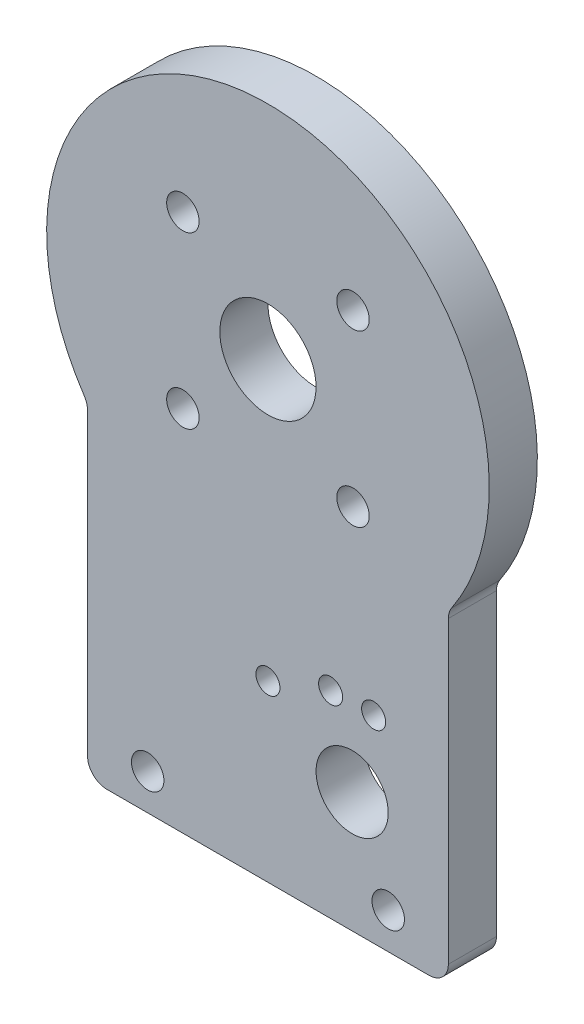
ISO-10303-21;
HEADER;
FILE_DESCRIPTION(('STEP AP214'),'2;1');
FILE_NAME('part.step','',(''),(''),'','','');
FILE_SCHEMA(('AUTOMOTIVE_DESIGN { 1 0 10303 214 1 1 1 1 }'));
ENDSEC;
DATA;
#1=APPLICATION_CONTEXT('core data for automotive mechanical design processes');
#2=APPLICATION_PROTOCOL_DEFINITION('international standard','automotive_design',2000,#1);
#3=PRODUCT_CONTEXT('',#1,'mechanical');
#4=PRODUCT('Part','Part','',(#3));
#5=PRODUCT_RELATED_PRODUCT_CATEGORY('part','',(#4));
#6=PRODUCT_DEFINITION_FORMATION('','',#4);
#7=PRODUCT_DEFINITION_CONTEXT('part definition',#1,'design');
#8=PRODUCT_DEFINITION('design','',#6,#7);
#9=PRODUCT_DEFINITION_SHAPE('','',#8);
#10=(LENGTH_UNIT() NAMED_UNIT(*) SI_UNIT(.MILLI.,.METRE.));
#11=(NAMED_UNIT(*) PLANE_ANGLE_UNIT() SI_UNIT($,.RADIAN.));
#12=(NAMED_UNIT(*) SI_UNIT($,.STERADIAN.) SOLID_ANGLE_UNIT());
#13=UNCERTAINTY_MEASURE_WITH_UNIT(LENGTH_MEASURE(1.E-05),#10,'distance_accuracy_value','');
#14=(GEOMETRIC_REPRESENTATION_CONTEXT(3) GLOBAL_UNCERTAINTY_ASSIGNED_CONTEXT((#13)) GLOBAL_UNIT_ASSIGNED_CONTEXT((#10,
#11,#12)) REPRESENTATION_CONTEXT('',''));
#15=CARTESIAN_POINT('',(0.,0.,0.));
#16=DIRECTION('',(0.,0.,1.));
#17=DIRECTION('',(1.,0.,0.));
#18=AXIS2_PLACEMENT_3D('',#15,#16,#17);
#19=CARTESIAN_POINT('',(0.,0.,4.));
#20=DIRECTION('',(0.,0.,1.));
#21=DIRECTION('',(1.,0.,0.));
#22=AXIS2_PLACEMENT_3D('',#19,#20,#21);
#23=PLANE('',#22);
#24=CARTESIAN_POINT('',(0.,-23.1564534438058,4.));
#25=DIRECTION('',(0.,0.,1.));
#26=DIRECTION('',(1.,0.,0.));
#27=AXIS2_PLACEMENT_3D('',#24,#25,#26);
#28=CIRCLE('',#27,1.);
#29=CARTESIAN_POINT('',(1.,-23.1564534438058,4.));
#30=VERTEX_POINT('',#29);
#31=EDGE_CURVE('E230',#30,#30,#28,.T.);
#32=ORIENTED_EDGE('',*,*,#31,.F.);
#33=EDGE_LOOP('',(#32));
#34=FACE_BOUND('',#33,.T.);
#35=CARTESIAN_POINT('',(7.,-27.6564534438058,4.));
#36=DIRECTION('',(0.,0.,1.));
#37=DIRECTION('',(1.,0.,0.));
#38=AXIS2_PLACEMENT_3D('',#35,#36,#37);
#39=CIRCLE('',#38,3.);
#40=CARTESIAN_POINT('',(10.,-27.6564534438058,4.));
#41=VERTEX_POINT('',#40);
#42=EDGE_CURVE('E225',#41,#41,#39,.T.);
#43=ORIENTED_EDGE('',*,*,#42,.F.);
#44=EDGE_LOOP('',(#43));
#45=FACE_BOUND('',#44,.T.);
#46=CARTESIAN_POINT('',(5.21114561800017,-21.2341622078054,4.));
#47=DIRECTION('',(0.,0.,1.));
#48=DIRECTION('',(1.,0.,0.));
#49=AXIS2_PLACEMENT_3D('',#46,#47,#48);
#50=CIRCLE('',#49,1.);
#51=CARTESIAN_POINT('',(6.21114561800017,-21.2341622078054,4.));
#52=VERTEX_POINT('',#51);
#53=EDGE_CURVE('E219',#52,#52,#50,.T.);
#54=ORIENTED_EDGE('',*,*,#53,.F.);
#55=EDGE_LOOP('',(#54));
#56=FACE_BOUND('',#55,.T.);
#57=CARTESIAN_POINT('',(8.78885438199983,-21.2341622078054,4.));
#58=DIRECTION('',(0.,0.,1.));
#59=DIRECTION('',(-1.,0.,0.));
#60=AXIS2_PLACEMENT_3D('',#57,#58,#59);
#61=CIRCLE('',#60,1.);
#62=CARTESIAN_POINT('',(7.78885438199983,-21.2341622078054,4.));
#63=VERTEX_POINT('',#62);
#64=EDGE_CURVE('E212',#63,#63,#61,.T.);
#65=ORIENTED_EDGE('',*,*,#64,.F.);
#66=EDGE_LOOP('',(#65));
#67=FACE_BOUND('',#66,.T.);
#68=CARTESIAN_POINT('',(-9.99999999999999,-34.6564534438058,4.));
#69=DIRECTION('',(0.,0.,1.));
#70=DIRECTION('',(1.,0.,0.));
#71=AXIS2_PLACEMENT_3D('',#68,#69,#70);
#72=CIRCLE('',#71,1.35);
#73=CARTESIAN_POINT('',(-8.65,-34.6564534438058,4.));
#74=VERTEX_POINT('',#73);
#75=EDGE_CURVE('E197',#74,#74,#72,.T.);
#76=ORIENTED_EDGE('',*,*,#75,.F.);
#77=EDGE_LOOP('',(#76));
#78=FACE_BOUND('',#77,.T.);
#79=CARTESIAN_POINT('',(7.07106781186553,7.07106781186542,4.));
#80=DIRECTION('',(0.,0.,1.));
#81=DIRECTION('',(1.,0.,0.));
#82=AXIS2_PLACEMENT_3D('',#79,#80,#81);
#83=CIRCLE('',#82,1.35);
#84=CARTESIAN_POINT('',(8.42106781186552,7.07106781186542,4.));
#85=VERTEX_POINT('',#84);
#86=EDGE_CURVE('E185',#85,#85,#83,.T.);
#87=ORIENTED_EDGE('',*,*,#86,.F.);
#88=EDGE_LOOP('',(#87));
#89=FACE_BOUND('',#88,.T.);
#90=CARTESIAN_POINT('',(0.,0.,4.));
#91=DIRECTION('',(0.,0.,1.));
#92=DIRECTION('',(1.,0.,0.));
#93=AXIS2_PLACEMENT_3D('',#90,#91,#92);
#94=CIRCLE('',#93,4.);
#95=CARTESIAN_POINT('',(4.,0.,4.));
#96=VERTEX_POINT('',#95);
#97=EDGE_CURVE('E174',#96,#96,#94,.T.);
#98=ORIENTED_EDGE('',*,*,#97,.F.);
#99=EDGE_LOOP('',(#98));
#100=FACE_BOUND('',#99,.T.);
#101=DIRECTION('',(1.,0.,0.));
#102=VECTOR('',#101,1.);
#103=CARTESIAN_POINT('',(-15.,-37.6564534438058,4.));
#104=LINE('',#103,#102);
#105=CARTESIAN_POINT('',(-13.4,-37.6564534438058,4.));
#106=VERTEX_POINT('',#105);
#107=CARTESIAN_POINT('',(13.4,-37.6564534438058,4.));
#108=VERTEX_POINT('',#107);
#109=EDGE_CURVE('E167',#106,#108,#104,.T.);
#110=ORIENTED_EDGE('',*,*,#109,.T.);
#111=CARTESIAN_POINT('',(13.4,-36.0564534438058,4.));
#112=DIRECTION('',(0.,0.,1.));
#113=DIRECTION('',(1.,0.,0.));
#114=AXIS2_PLACEMENT_3D('',#111,#112,#113);
#115=CIRCLE('',#114,1.6);
#116=CARTESIAN_POINT('',(15.,-36.0564534438058,4.));
#117=VERTEX_POINT('',#116);
#118=EDGE_CURVE('E155',#108,#117,#115,.T.);
#119=ORIENTED_EDGE('',*,*,#118,.T.);
#120=DIRECTION('',(0.,1.,0.));
#121=VECTOR('',#120,1.);
#122=CARTESIAN_POINT('',(15.,-10.6564534438058,4.));
#123=LINE('',#122,#121);
#124=CARTESIAN_POINT('',(15.,-11.1552678139075,4.));
#125=VERTEX_POINT('',#124);
#126=EDGE_CURVE('E133',#117,#125,#123,.T.);
#127=ORIENTED_EDGE('',*,*,#126,.T.);
#128=CARTESIAN_POINT('',(16.6,-11.1552678139075,4.));
#129=DIRECTION('',(0.,0.,1.));
#130=DIRECTION('',(1.,0.,0.));
#131=AXIS2_PLACEMENT_3D('',#128,#129,#130);
#132=CIRCLE('',#131,1.6);
#133=CARTESIAN_POINT('',(15.272,-10.2628463887949,4.));
#134=VERTEX_POINT('',#133);
#135=EDGE_CURVE('E108',#125,#134,#132,.F.);
#136=ORIENTED_EDGE('',*,*,#135,.T.);
#137=CARTESIAN_POINT('',(0.,0.,4.));
#138=DIRECTION('',(0.,0.,1.));
#139=DIRECTION('',(1.,0.,0.));
#140=AXIS2_PLACEMENT_3D('',#137,#138,#139);
#141=CIRCLE('',#140,18.4);
#142=CARTESIAN_POINT('',(-15.272,-10.2628463887949,4.));
#143=VERTEX_POINT('',#142);
#144=EDGE_CURVE('E117',#134,#143,#141,.T.);
#145=ORIENTED_EDGE('',*,*,#144,.T.);
#146=CARTESIAN_POINT('',(-16.6,-11.1552678139075,4.));
#147=DIRECTION('',(0.,0.,1.));
#148=DIRECTION('',(1.,0.,0.));
#149=AXIS2_PLACEMENT_3D('',#146,#147,#148);
#150=CIRCLE('',#149,1.6);
#151=CARTESIAN_POINT('',(-15.,-11.1552678139075,4.));
#152=VERTEX_POINT('',#151);
#153=EDGE_CURVE('E11',#143,#152,#150,.F.);
#154=ORIENTED_EDGE('',*,*,#153,.T.);
#155=DIRECTION('',(0.,-1.,0.));
#156=VECTOR('',#155,1.);
#157=CARTESIAN_POINT('',(-15.,-10.6564534438058,4.));
#158=LINE('',#157,#156);
#159=CARTESIAN_POINT('',(-15.,-36.0564534438058,4.));
#160=VERTEX_POINT('',#159);
#161=EDGE_CURVE('E168',#152,#160,#158,.T.);
#162=ORIENTED_EDGE('',*,*,#161,.T.);
#163=CARTESIAN_POINT('',(-13.4,-36.0564534438058,4.));
#164=DIRECTION('',(0.,0.,1.));
#165=DIRECTION('',(1.,0.,0.));
#166=AXIS2_PLACEMENT_3D('',#163,#164,#165);
#167=CIRCLE('',#166,1.6);
#168=EDGE_CURVE('E153',#160,#106,#167,.T.);
#169=ORIENTED_EDGE('',*,*,#168,.T.);
#170=EDGE_LOOP('',(#110,#119,#127,#136,#145,#154,#162,#169));
#171=FACE_BOUND('',#170,.T.);
#172=CARTESIAN_POINT('',(-7.07106781186547,-7.07106781186547,4.));
#173=DIRECTION('',(0.,0.,1.));
#174=DIRECTION('',(1.,0.,0.));
#175=AXIS2_PLACEMENT_3D('',#172,#173,#174);
#176=CIRCLE('',#175,1.35);
#177=CARTESIAN_POINT('',(-5.72106781186547,-7.07106781186547,4.));
#178=VERTEX_POINT('',#177);
#179=EDGE_CURVE('E125',#178,#178,#176,.T.);
#180=ORIENTED_EDGE('',*,*,#179,.F.);
#181=EDGE_LOOP('',(#180));
#182=FACE_BOUND('',#181,.T.);
#183=CARTESIAN_POINT('',(-7.07106781186545,7.0710678118655,4.));
#184=DIRECTION('',(0.,0.,1.));
#185=DIRECTION('',(1.,0.,0.));
#186=AXIS2_PLACEMENT_3D('',#183,#184,#185);
#187=CIRCLE('',#186,1.35);
#188=CARTESIAN_POINT('',(-5.72106781186545,7.0710678118655,4.));
#189=VERTEX_POINT('',#188);
#190=EDGE_CURVE('E179',#189,#189,#187,.T.);
#191=ORIENTED_EDGE('',*,*,#190,.F.);
#192=EDGE_LOOP('',(#191));
#193=FACE_BOUND('',#192,.T.);
#194=CARTESIAN_POINT('',(7.0710678118654,-7.07106781186555,4.));
#195=DIRECTION('',(0.,0.,1.));
#196=DIRECTION('',(1.,0.,0.));
#197=AXIS2_PLACEMENT_3D('',#194,#195,#196);
#198=CIRCLE('',#197,1.35);
#199=CARTESIAN_POINT('',(8.4210678118654,-7.07106781186555,4.));
#200=VERTEX_POINT('',#199);
#201=EDGE_CURVE('E191',#200,#200,#198,.T.);
#202=ORIENTED_EDGE('',*,*,#201,.F.);
#203=EDGE_LOOP('',(#202));
#204=FACE_BOUND('',#203,.T.);
#205=CARTESIAN_POINT('',(10.,-34.6564534438058,4.));
#206=DIRECTION('',(0.,0.,1.));
#207=DIRECTION('',(-1.,0.,0.));
#208=AXIS2_PLACEMENT_3D('',#205,#206,#207);
#209=CIRCLE('',#208,1.35);
#210=CARTESIAN_POINT('',(8.65,-34.6564534438058,4.));
#211=VERTEX_POINT('',#210);
#212=EDGE_CURVE('E203',#211,#211,#209,.T.);
#213=ORIENTED_EDGE('',*,*,#212,.F.);
#214=EDGE_LOOP('',(#213));
#215=FACE_BOUND('',#214,.T.);
#216=ADVANCED_FACE('F33',(#34,#45,#56,#67,#78,#89,#100,#171,#182,#193,#204,#215),#23,.T.);
#217=CARTESIAN_POINT('',(0.,0.,0.));
#218=DIRECTION('',(0.,0.,1.));
#219=DIRECTION('',(1.,0.,0.));
#220=AXIS2_PLACEMENT_3D('',#217,#218,#219);
#221=PLANE('',#220);
#222=CARTESIAN_POINT('',(0.,-23.1564534438058,0.));
#223=DIRECTION('',(0.,0.,1.));
#224=DIRECTION('',(1.,0.,0.));
#225=AXIS2_PLACEMENT_3D('',#222,#223,#224);
#226=CIRCLE('',#225,1.);
#227=CARTESIAN_POINT('',(1.,-23.1564534438058,0.));
#228=VERTEX_POINT('',#227);
#229=EDGE_CURVE('E216',#228,#228,#226,.T.);
#230=ORIENTED_EDGE('',*,*,#229,.T.);
#231=EDGE_LOOP('',(#230));
#232=FACE_BOUND('',#231,.T.);
#233=CARTESIAN_POINT('',(7.,-27.6564534438058,0.));
#234=DIRECTION('',(0.,0.,1.));
#235=DIRECTION('',(1.,0.,0.));
#236=AXIS2_PLACEMENT_3D('',#233,#234,#235);
#237=CIRCLE('',#236,3.);
#238=CARTESIAN_POINT('',(10.,-27.6564534438058,0.));
#239=VERTEX_POINT('',#238);
#240=EDGE_CURVE('E209',#239,#239,#237,.T.);
#241=ORIENTED_EDGE('',*,*,#240,.T.);
#242=EDGE_LOOP('',(#241));
#243=FACE_BOUND('',#242,.T.);
#244=CARTESIAN_POINT('',(5.21114561800017,-21.2341622078054,0.));
#245=DIRECTION('',(0.,0.,1.));
#246=DIRECTION('',(1.,0.,0.));
#247=AXIS2_PLACEMENT_3D('',#244,#245,#246);
#248=CIRCLE('',#247,1.);
#249=CARTESIAN_POINT('',(6.21114561800017,-21.2341622078054,0.));
#250=VERTEX_POINT('',#249);
#251=EDGE_CURVE('E222',#250,#250,#248,.T.);
#252=ORIENTED_EDGE('',*,*,#251,.T.);
#253=EDGE_LOOP('',(#252));
#254=FACE_BOUND('',#253,.T.);
#255=CARTESIAN_POINT('',(8.78885438199983,-21.2341622078054,0.));
#256=DIRECTION('',(0.,0.,1.));
#257=DIRECTION('',(-1.,0.,0.));
#258=AXIS2_PLACEMENT_3D('',#255,#256,#257);
#259=CIRCLE('',#258,1.);
#260=CARTESIAN_POINT('',(7.78885438199983,-21.2341622078054,0.));
#261=VERTEX_POINT('',#260);
#262=EDGE_CURVE('E215',#261,#261,#259,.T.);
#263=ORIENTED_EDGE('',*,*,#262,.T.);
#264=EDGE_LOOP('',(#263));
#265=FACE_BOUND('',#264,.T.);
#266=DIRECTION('',(0.,1.,0.));
#267=VECTOR('',#266,1.);
#268=CARTESIAN_POINT('',(15.,-10.6564534438058,0.));
#269=LINE('',#268,#267);
#270=CARTESIAN_POINT('',(15.,-36.0564534438058,0.));
#271=VERTEX_POINT('',#270);
#272=CARTESIAN_POINT('',(15.,-11.1552678139075,0.));
#273=VERTEX_POINT('',#272);
#274=EDGE_CURVE('E138',#271,#273,#269,.T.);
#275=ORIENTED_EDGE('',*,*,#274,.F.);
#276=CARTESIAN_POINT('',(13.4,-36.0564534438058,0.));
#277=DIRECTION('',(0.,0.,1.));
#278=DIRECTION('',(1.,0.,0.));
#279=AXIS2_PLACEMENT_3D('',#276,#277,#278);
#280=CIRCLE('',#279,1.6);
#281=CARTESIAN_POINT('',(13.4,-37.6564534438058,0.));
#282=VERTEX_POINT('',#281);
#283=EDGE_CURVE('E146',#271,#282,#280,.F.);
#284=ORIENTED_EDGE('',*,*,#283,.T.);
#285=DIRECTION('',(1.,0.,0.));
#286=VECTOR('',#285,1.);
#287=CARTESIAN_POINT('',(-15.,-37.6564534438058,0.));
#288=LINE('',#287,#286);
#289=CARTESIAN_POINT('',(-13.4,-37.6564534438058,0.));
#290=VERTEX_POINT('',#289);
#291=EDGE_CURVE('E127',#290,#282,#288,.T.);
#292=ORIENTED_EDGE('',*,*,#291,.F.);
#293=CARTESIAN_POINT('',(-13.4,-36.0564534438058,0.));
#294=DIRECTION('',(0.,0.,1.));
#295=DIRECTION('',(1.,0.,0.));
#296=AXIS2_PLACEMENT_3D('',#293,#294,#295);
#297=CIRCLE('',#296,1.6);
#298=CARTESIAN_POINT('',(-15.,-36.0564534438058,0.));
#299=VERTEX_POINT('',#298);
#300=EDGE_CURVE('E144',#290,#299,#297,.F.);
#301=ORIENTED_EDGE('',*,*,#300,.T.);
#302=DIRECTION('',(0.,-1.,0.));
#303=VECTOR('',#302,1.);
#304=CARTESIAN_POINT('',(-15.,-10.6564534438058,0.));
#305=LINE('',#304,#303);
#306=CARTESIAN_POINT('',(-15.,-11.1552678139075,0.));
#307=VERTEX_POINT('',#306);
#308=EDGE_CURVE('E124',#307,#299,#305,.T.);
#309=ORIENTED_EDGE('',*,*,#308,.F.);
#310=CARTESIAN_POINT('',(-16.6,-11.1552678139075,0.));
#311=DIRECTION('',(0.,0.,1.));
#312=DIRECTION('',(1.,0.,0.));
#313=AXIS2_PLACEMENT_3D('',#310,#311,#312);
#314=CIRCLE('',#313,1.6);
#315=CARTESIAN_POINT('',(-15.272,-10.2628463887949,0.));
#316=VERTEX_POINT('',#315);
#317=EDGE_CURVE('E41',#307,#316,#314,.T.);
#318=ORIENTED_EDGE('',*,*,#317,.T.);
#319=CARTESIAN_POINT('',(0.,0.,0.));
#320=DIRECTION('',(0.,0.,1.));
#321=DIRECTION('',(1.,0.,0.));
#322=AXIS2_PLACEMENT_3D('',#319,#320,#321);
#323=CIRCLE('',#322,18.4);
#324=CARTESIAN_POINT('',(15.272,-10.2628463887949,0.));
#325=VERTEX_POINT('',#324);
#326=EDGE_CURVE('E115',#325,#316,#323,.T.);
#327=ORIENTED_EDGE('',*,*,#326,.F.);
#328=CARTESIAN_POINT('',(16.6,-11.1552678139075,0.));
#329=DIRECTION('',(0.,0.,1.));
#330=DIRECTION('',(1.,0.,0.));
#331=AXIS2_PLACEMENT_3D('',#328,#329,#330);
#332=CIRCLE('',#331,1.6);
#333=EDGE_CURVE('E98',#325,#273,#332,.T.);
#334=ORIENTED_EDGE('',*,*,#333,.T.);
#335=EDGE_LOOP('',(#275,#284,#292,#301,#309,#318,#327,#334));
#336=FACE_BOUND('',#335,.T.);
#337=CARTESIAN_POINT('',(-7.07106781186547,-7.07106781186547,0.));
#338=DIRECTION('',(0.,0.,1.));
#339=DIRECTION('',(1.,0.,0.));
#340=AXIS2_PLACEMENT_3D('',#337,#338,#339);
#341=CIRCLE('',#340,1.35);
#342=CARTESIAN_POINT('',(-5.72106781186547,-7.07106781186547,0.));
#343=VERTEX_POINT('',#342);
#344=EDGE_CURVE('E130',#343,#343,#341,.T.);
#345=ORIENTED_EDGE('',*,*,#344,.T.);
#346=EDGE_LOOP('',(#345));
#347=FACE_BOUND('',#346,.T.);
#348=CARTESIAN_POINT('',(0.,0.,0.));
#349=DIRECTION('',(0.,0.,1.));
#350=DIRECTION('',(1.,0.,0.));
#351=AXIS2_PLACEMENT_3D('',#348,#349,#350);
#352=CIRCLE('',#351,4.);
#353=CARTESIAN_POINT('',(4.,0.,0.));
#354=VERTEX_POINT('',#353);
#355=EDGE_CURVE('E176',#354,#354,#352,.T.);
#356=ORIENTED_EDGE('',*,*,#355,.T.);
#357=EDGE_LOOP('',(#356));
#358=FACE_BOUND('',#357,.T.);
#359=CARTESIAN_POINT('',(-7.07106781186545,7.0710678118655,0.));
#360=DIRECTION('',(0.,0.,1.));
#361=DIRECTION('',(1.,0.,0.));
#362=AXIS2_PLACEMENT_3D('',#359,#360,#361);
#363=CIRCLE('',#362,1.35);
#364=CARTESIAN_POINT('',(-5.72106781186545,7.0710678118655,0.));
#365=VERTEX_POINT('',#364);
#366=EDGE_CURVE('E182',#365,#365,#363,.T.);
#367=ORIENTED_EDGE('',*,*,#366,.T.);
#368=EDGE_LOOP('',(#367));
#369=FACE_BOUND('',#368,.T.);
#370=CARTESIAN_POINT('',(7.07106781186553,7.07106781186542,0.));
#371=DIRECTION('',(0.,0.,1.));
#372=DIRECTION('',(1.,0.,0.));
#373=AXIS2_PLACEMENT_3D('',#370,#371,#372);
#374=CIRCLE('',#373,1.35);
#375=CARTESIAN_POINT('',(8.42106781186552,7.07106781186542,0.));
#376=VERTEX_POINT('',#375);
#377=EDGE_CURVE('E188',#376,#376,#374,.T.);
#378=ORIENTED_EDGE('',*,*,#377,.T.);
#379=EDGE_LOOP('',(#378));
#380=FACE_BOUND('',#379,.T.);
#381=CARTESIAN_POINT('',(7.0710678118654,-7.07106781186555,0.));
#382=DIRECTION('',(0.,0.,1.));
#383=DIRECTION('',(1.,0.,0.));
#384=AXIS2_PLACEMENT_3D('',#381,#382,#383);
#385=CIRCLE('',#384,1.35);
#386=CARTESIAN_POINT('',(8.4210678118654,-7.07106781186555,0.));
#387=VERTEX_POINT('',#386);
#388=EDGE_CURVE('E194',#387,#387,#385,.T.);
#389=ORIENTED_EDGE('',*,*,#388,.T.);
#390=EDGE_LOOP('',(#389));
#391=FACE_BOUND('',#390,.T.);
#392=CARTESIAN_POINT('',(-9.99999999999999,-34.6564534438058,0.));
#393=DIRECTION('',(0.,0.,1.));
#394=DIRECTION('',(1.,0.,0.));
#395=AXIS2_PLACEMENT_3D('',#392,#393,#394);
#396=CIRCLE('',#395,1.35);
#397=CARTESIAN_POINT('',(-8.65,-34.6564534438058,0.));
#398=VERTEX_POINT('',#397);
#399=EDGE_CURVE('E200',#398,#398,#396,.T.);
#400=ORIENTED_EDGE('',*,*,#399,.T.);
#401=EDGE_LOOP('',(#400));
#402=FACE_BOUND('',#401,.T.);
#403=CARTESIAN_POINT('',(10.,-34.6564534438058,0.));
#404=DIRECTION('',(0.,0.,1.));
#405=DIRECTION('',(-1.,0.,0.));
#406=AXIS2_PLACEMENT_3D('',#403,#404,#405);
#407=CIRCLE('',#406,1.35);
#408=CARTESIAN_POINT('',(8.65,-34.6564534438058,0.));
#409=VERTEX_POINT('',#408);
#410=EDGE_CURVE('E206',#409,#409,#407,.T.);
#411=ORIENTED_EDGE('',*,*,#410,.T.);
#412=EDGE_LOOP('',(#411));
#413=FACE_BOUND('',#412,.T.);
#414=ADVANCED_FACE('F121',(#232,#243,#254,#265,#336,#347,#358,#369,#380,#391,#402,#413),#221,.F.);
#415=CARTESIAN_POINT('',(0.,0.,4.));
#416=DIRECTION('',(0.,0.,-1.));
#417=DIRECTION('',(-1.,0.,0.));
#418=AXIS2_PLACEMENT_3D('',#415,#416,#417);
#419=CYLINDRICAL_SURFACE('',#418,18.4);
#420=ORIENTED_EDGE('',*,*,#144,.F.);
#421=DIRECTION('',(0.,0.,-1.));
#422=VECTOR('',#421,1.);
#423=CARTESIAN_POINT('',(15.272,-10.2628463887949,4.));
#424=LINE('',#423,#422);
#425=EDGE_CURVE('E102',#134,#325,#424,.T.);
#426=ORIENTED_EDGE('',*,*,#425,.T.);
#427=ORIENTED_EDGE('',*,*,#326,.T.);
#428=DIRECTION('',(0.,0.,-1.));
#429=VECTOR('',#428,1.);
#430=CARTESIAN_POINT('',(-15.272,-10.2628463887949,4.));
#431=LINE('',#430,#429);
#432=EDGE_CURVE('E119',#316,#143,#431,.F.);
#433=ORIENTED_EDGE('',*,*,#432,.T.);
#434=EDGE_LOOP('',(#420,#426,#427,#433));
#435=FACE_BOUND('',#434,.T.);
#436=ADVANCED_FACE('F114',(#435),#419,.T.);
#437=CARTESIAN_POINT('',(-15.,-10.6564534438058,4.));
#438=DIRECTION('',(1.,0.,0.));
#439=DIRECTION('',(0.,1.,0.));
#440=AXIS2_PLACEMENT_3D('',#437,#438,#439);
#441=PLANE('',#440);
#442=ORIENTED_EDGE('',*,*,#161,.F.);
#443=DIRECTION('',(0.,0.,1.));
#444=VECTOR('',#443,1.);
#445=CARTESIAN_POINT('',(-15.,-11.1552678139075,0.));
#446=LINE('',#445,#444);
#447=EDGE_CURVE('E109',#152,#307,#446,.F.);
#448=ORIENTED_EDGE('',*,*,#447,.T.);
#449=ORIENTED_EDGE('',*,*,#308,.T.);
#450=DIRECTION('',(0.,0.,-1.));
#451=VECTOR('',#450,1.);
#452=CARTESIAN_POINT('',(-15.,-36.0564534438058,4.));
#453=LINE('',#452,#451);
#454=EDGE_CURVE('E48',#299,#160,#453,.F.);
#455=ORIENTED_EDGE('',*,*,#454,.T.);
#456=EDGE_LOOP('',(#442,#448,#449,#455));
#457=FACE_BOUND('',#456,.T.);
#458=ADVANCED_FACE('F317',(#457),#441,.F.);
#459=CARTESIAN_POINT('',(-15.,-37.6564534438058,4.));
#460=DIRECTION('',(0.,1.,0.));
#461=DIRECTION('',(-1.,0.,0.));
#462=AXIS2_PLACEMENT_3D('',#459,#460,#461);
#463=PLANE('',#462);
#464=ORIENTED_EDGE('',*,*,#291,.T.);
#465=DIRECTION('',(0.,0.,-1.));
#466=VECTOR('',#465,1.);
#467=CARTESIAN_POINT('',(13.4,-37.6564534438058,4.));
#468=LINE('',#467,#466);
#469=EDGE_CURVE('E151',#282,#108,#468,.F.);
#470=ORIENTED_EDGE('',*,*,#469,.T.);
#471=ORIENTED_EDGE('',*,*,#109,.F.);
#472=DIRECTION('',(0.,0.,-1.));
#473=VECTOR('',#472,1.);
#474=CARTESIAN_POINT('',(-13.4,-37.6564534438058,4.));
#475=LINE('',#474,#473);
#476=EDGE_CURVE('E148',#106,#290,#475,.T.);
#477=ORIENTED_EDGE('',*,*,#476,.T.);
#478=EDGE_LOOP('',(#464,#470,#471,#477));
#479=FACE_BOUND('',#478,.T.);
#480=ADVANCED_FACE('F314',(#479),#463,.F.);
#481=CARTESIAN_POINT('',(15.,-10.6564534438058,4.));
#482=DIRECTION('',(-1.,0.,0.));
#483=DIRECTION('',(0.,-1.,0.));
#484=AXIS2_PLACEMENT_3D('',#481,#482,#483);
#485=PLANE('',#484);
#486=ORIENTED_EDGE('',*,*,#274,.T.);
#487=DIRECTION('',(0.,0.,1.));
#488=VECTOR('',#487,1.);
#489=CARTESIAN_POINT('',(15.,-11.1552678139075,4.));
#490=LINE('',#489,#488);
#491=EDGE_CURVE('E103',#273,#125,#490,.T.);
#492=ORIENTED_EDGE('',*,*,#491,.T.);
#493=ORIENTED_EDGE('',*,*,#126,.F.);
#494=DIRECTION('',(0.,0.,-1.));
#495=VECTOR('',#494,1.);
#496=CARTESIAN_POINT('',(15.,-36.0564534438058,4.));
#497=LINE('',#496,#495);
#498=EDGE_CURVE('E118',#117,#271,#497,.T.);
#499=ORIENTED_EDGE('',*,*,#498,.T.);
#500=EDGE_LOOP('',(#486,#492,#493,#499));
#501=FACE_BOUND('',#500,.T.);
#502=ADVANCED_FACE('F309',(#501),#485,.F.);
#503=CARTESIAN_POINT('',(-7.07106781186547,-7.07106781186547,4.));
#504=DIRECTION('',(0.,0.,-1.));
#505=DIRECTION('',(-1.,0.,0.));
#506=AXIS2_PLACEMENT_3D('',#503,#504,#505);
#507=CYLINDRICAL_SURFACE('',#506,1.35);
#508=ORIENTED_EDGE('',*,*,#179,.T.);
#509=EDGE_LOOP('',(#508));
#510=FACE_BOUND('',#509,.T.);
#511=ORIENTED_EDGE('',*,*,#344,.F.);
#512=EDGE_LOOP('',(#511));
#513=FACE_BOUND('',#512,.T.);
#514=ADVANCED_FACE('F263',(#510,#513),#507,.F.);
#515=CARTESIAN_POINT('',(0.,0.,4.));
#516=DIRECTION('',(0.,0.,-1.));
#517=DIRECTION('',(-1.,0.,0.));
#518=AXIS2_PLACEMENT_3D('',#515,#516,#517);
#519=CYLINDRICAL_SURFACE('',#518,4.);
#520=ORIENTED_EDGE('',*,*,#97,.T.);
#521=EDGE_LOOP('',(#520));
#522=FACE_BOUND('',#521,.T.);
#523=ORIENTED_EDGE('',*,*,#355,.F.);
#524=EDGE_LOOP('',(#523));
#525=FACE_BOUND('',#524,.T.);
#526=ADVANCED_FACE('F259',(#522,#525),#519,.F.);
#527=CARTESIAN_POINT('',(-7.07106781186545,7.0710678118655,4.));
#528=DIRECTION('',(0.,0.,-1.));
#529=DIRECTION('',(-1.,0.,0.));
#530=AXIS2_PLACEMENT_3D('',#527,#528,#529);
#531=CYLINDRICAL_SURFACE('',#530,1.35);
#532=ORIENTED_EDGE('',*,*,#190,.T.);
#533=EDGE_LOOP('',(#532));
#534=FACE_BOUND('',#533,.T.);
#535=ORIENTED_EDGE('',*,*,#366,.F.);
#536=EDGE_LOOP('',(#535));
#537=FACE_BOUND('',#536,.T.);
#538=ADVANCED_FACE('F262',(#534,#537),#531,.F.);
#539=CARTESIAN_POINT('',(7.07106781186553,7.07106781186542,4.));
#540=DIRECTION('',(0.,0.,-1.));
#541=DIRECTION('',(-1.,0.,0.));
#542=AXIS2_PLACEMENT_3D('',#539,#540,#541);
#543=CYLINDRICAL_SURFACE('',#542,1.35);
#544=ORIENTED_EDGE('',*,*,#86,.T.);
#545=EDGE_LOOP('',(#544));
#546=FACE_BOUND('',#545,.T.);
#547=ORIENTED_EDGE('',*,*,#377,.F.);
#548=EDGE_LOOP('',(#547));
#549=FACE_BOUND('',#548,.T.);
#550=ADVANCED_FACE('F300',(#546,#549),#543,.F.);
#551=CARTESIAN_POINT('',(7.0710678118654,-7.07106781186555,4.));
#552=DIRECTION('',(0.,0.,-1.));
#553=DIRECTION('',(-1.,0.,0.));
#554=AXIS2_PLACEMENT_3D('',#551,#552,#553);
#555=CYLINDRICAL_SURFACE('',#554,1.35);
#556=ORIENTED_EDGE('',*,*,#201,.T.);
#557=EDGE_LOOP('',(#556));
#558=FACE_BOUND('',#557,.T.);
#559=ORIENTED_EDGE('',*,*,#388,.F.);
#560=EDGE_LOOP('',(#559));
#561=FACE_BOUND('',#560,.T.);
#562=ADVANCED_FACE('F293',(#558,#561),#555,.F.);
#563=CARTESIAN_POINT('',(-9.99999999999999,-34.6564534438058,4.));
#564=DIRECTION('',(0.,0.,-1.));
#565=DIRECTION('',(-1.,0.,0.));
#566=AXIS2_PLACEMENT_3D('',#563,#564,#565);
#567=CYLINDRICAL_SURFACE('',#566,1.35);
#568=ORIENTED_EDGE('',*,*,#75,.T.);
#569=EDGE_LOOP('',(#568));
#570=FACE_BOUND('',#569,.T.);
#571=ORIENTED_EDGE('',*,*,#399,.F.);
#572=EDGE_LOOP('',(#571));
#573=FACE_BOUND('',#572,.T.);
#574=ADVANCED_FACE('F283',(#570,#573),#567,.F.);
#575=CARTESIAN_POINT('',(10.,-34.6564534438058,4.));
#576=DIRECTION('',(0.,0.,-1.));
#577=DIRECTION('',(-1.,0.,0.));
#578=AXIS2_PLACEMENT_3D('',#575,#576,#577);
#579=CYLINDRICAL_SURFACE('',#578,1.35);
#580=ORIENTED_EDGE('',*,*,#212,.T.);
#581=EDGE_LOOP('',(#580));
#582=FACE_BOUND('',#581,.T.);
#583=ORIENTED_EDGE('',*,*,#410,.F.);
#584=EDGE_LOOP('',(#583));
#585=FACE_BOUND('',#584,.T.);
#586=ADVANCED_FACE('F280',(#582,#585),#579,.F.);
#587=CARTESIAN_POINT('',(8.78885438199983,-21.2341622078054,0.));
#588=DIRECTION('',(0.,0.,1.));
#589=DIRECTION('',(1.,0.,0.));
#590=AXIS2_PLACEMENT_3D('',#587,#588,#589);
#591=CYLINDRICAL_SURFACE('',#590,1.);
#592=ORIENTED_EDGE('',*,*,#262,.F.);
#593=EDGE_LOOP('',(#592));
#594=FACE_BOUND('',#593,.T.);
#595=ORIENTED_EDGE('',*,*,#64,.T.);
#596=EDGE_LOOP('',(#595));
#597=FACE_BOUND('',#596,.T.);
#598=ADVANCED_FACE('F282',(#594,#597),#591,.F.);
#599=CARTESIAN_POINT('',(5.21114561800017,-21.2341622078054,0.));
#600=DIRECTION('',(0.,0.,1.));
#601=DIRECTION('',(1.,0.,0.));
#602=AXIS2_PLACEMENT_3D('',#599,#600,#601);
#603=CYLINDRICAL_SURFACE('',#602,1.);
#604=ORIENTED_EDGE('',*,*,#251,.F.);
#605=EDGE_LOOP('',(#604));
#606=FACE_BOUND('',#605,.T.);
#607=ORIENTED_EDGE('',*,*,#53,.T.);
#608=EDGE_LOOP('',(#607));
#609=FACE_BOUND('',#608,.T.);
#610=ADVANCED_FACE('F290',(#606,#609),#603,.F.);
#611=CARTESIAN_POINT('',(7.,-27.6564534438058,0.));
#612=DIRECTION('',(0.,0.,1.));
#613=DIRECTION('',(1.,0.,0.));
#614=AXIS2_PLACEMENT_3D('',#611,#612,#613);
#615=CYLINDRICAL_SURFACE('',#614,3.);
#616=ORIENTED_EDGE('',*,*,#240,.F.);
#617=EDGE_LOOP('',(#616));
#618=FACE_BOUND('',#617,.T.);
#619=ORIENTED_EDGE('',*,*,#42,.T.);
#620=EDGE_LOOP('',(#619));
#621=FACE_BOUND('',#620,.T.);
#622=ADVANCED_FACE('F326',(#618,#621),#615,.F.);
#623=CARTESIAN_POINT('',(16.6,-11.1552678139075,4.));
#624=DIRECTION('',(0.,0.,-1.));
#625=DIRECTION('',(-1.,0.,0.));
#626=AXIS2_PLACEMENT_3D('',#623,#624,#625);
#627=CYLINDRICAL_SURFACE('',#626,1.6);
#628=ORIENTED_EDGE('',*,*,#135,.F.);
#629=ORIENTED_EDGE('',*,*,#491,.F.);
#630=ORIENTED_EDGE('',*,*,#333,.F.);
#631=ORIENTED_EDGE('',*,*,#425,.F.);
#632=EDGE_LOOP('',(#628,#629,#630,#631));
#633=FACE_BOUND('',#632,.T.);
#634=ADVANCED_FACE('F101',(#633),#627,.F.);
#635=CARTESIAN_POINT('',(13.4,-36.0564534438058,4.));
#636=DIRECTION('',(0.,0.,-1.));
#637=DIRECTION('',(-1.,0.,0.));
#638=AXIS2_PLACEMENT_3D('',#635,#636,#637);
#639=CYLINDRICAL_SURFACE('',#638,1.6);
#640=ORIENTED_EDGE('',*,*,#118,.F.);
#641=ORIENTED_EDGE('',*,*,#469,.F.);
#642=ORIENTED_EDGE('',*,*,#283,.F.);
#643=ORIENTED_EDGE('',*,*,#498,.F.);
#644=EDGE_LOOP('',(#640,#641,#642,#643));
#645=FACE_BOUND('',#644,.T.);
#646=ADVANCED_FACE('F325',(#645),#639,.T.);
#647=CARTESIAN_POINT('',(-16.6,-11.1552678139075,4.));
#648=DIRECTION('',(0.,0.,-1.));
#649=DIRECTION('',(-1.,0.,0.));
#650=AXIS2_PLACEMENT_3D('',#647,#648,#649);
#651=CYLINDRICAL_SURFACE('',#650,1.6);
#652=ORIENTED_EDGE('',*,*,#153,.F.);
#653=ORIENTED_EDGE('',*,*,#432,.F.);
#654=ORIENTED_EDGE('',*,*,#317,.F.);
#655=ORIENTED_EDGE('',*,*,#447,.F.);
#656=EDGE_LOOP('',(#652,#653,#654,#655));
#657=FACE_BOUND('',#656,.T.);
#658=ADVANCED_FACE('F328',(#657),#651,.F.);
#659=CARTESIAN_POINT('',(-13.4,-36.0564534438058,4.));
#660=DIRECTION('',(0.,0.,-1.));
#661=DIRECTION('',(-1.,0.,0.));
#662=AXIS2_PLACEMENT_3D('',#659,#660,#661);
#663=CYLINDRICAL_SURFACE('',#662,1.6);
#664=ORIENTED_EDGE('',*,*,#168,.F.);
#665=ORIENTED_EDGE('',*,*,#454,.F.);
#666=ORIENTED_EDGE('',*,*,#300,.F.);
#667=ORIENTED_EDGE('',*,*,#476,.F.);
#668=EDGE_LOOP('',(#664,#665,#666,#667));
#669=FACE_BOUND('',#668,.T.);
#670=ADVANCED_FACE('F35',(#669),#663,.T.);
#671=CARTESIAN_POINT('',(0.,-23.1564534438058,0.));
#672=DIRECTION('',(0.,0.,1.));
#673=DIRECTION('',(1.,0.,0.));
#674=AXIS2_PLACEMENT_3D('',#671,#672,#673);
#675=CYLINDRICAL_SURFACE('',#674,1.);
#676=ORIENTED_EDGE('',*,*,#229,.F.);
#677=EDGE_LOOP('',(#676));
#678=FACE_BOUND('',#677,.T.);
#679=ORIENTED_EDGE('',*,*,#31,.T.);
#680=EDGE_LOOP('',(#679));
#681=FACE_BOUND('',#680,.T.);
#682=ADVANCED_FACE('F238',(#678,#681),#675,.F.);
#683=CLOSED_SHELL('',(#216,#414,#436,#458,#480,#502,#514,#526,#538,#550,#562,#574,#586,#598,
#610,#622,#634,#646,#658,#670,#682));
#684=MANIFOLD_SOLID_BREP('B2',#683);
#685=ADVANCED_BREP_SHAPE_REPRESENTATION('',(#18,#684),#14);
#686=SHAPE_DEFINITION_REPRESENTATION(#9,#685);
ENDSEC;
END-ISO-10303-21;
